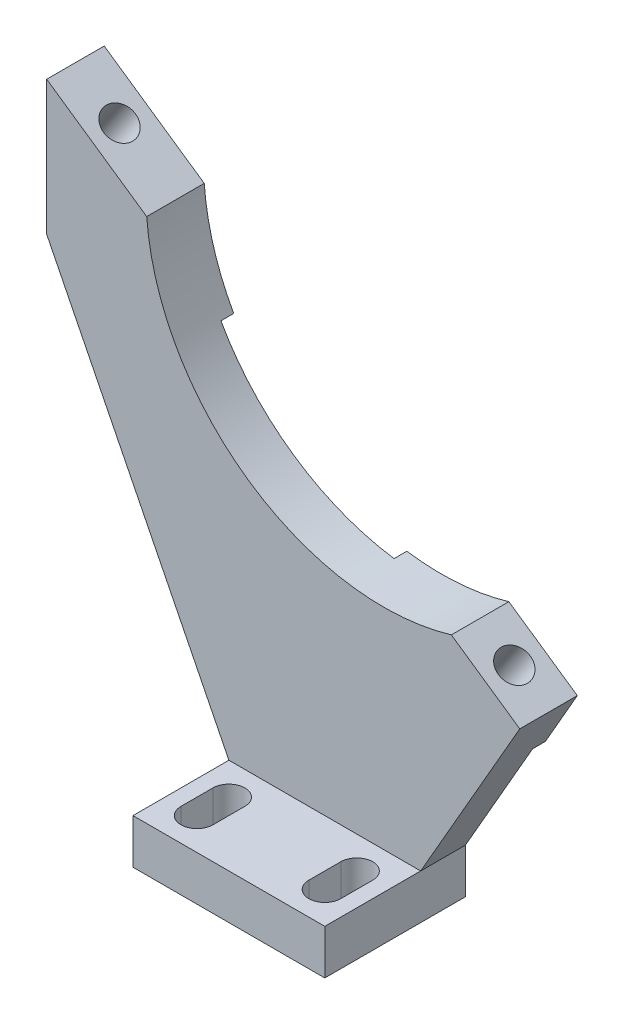
ISO-10303-21;
HEADER;
FILE_DESCRIPTION(('STEP AP214'),'2;1');
FILE_NAME('part.step','',(''),(''),'','','');
FILE_SCHEMA(('AUTOMOTIVE_DESIGN { 1 0 10303 214 1 1 1 1 }'));
ENDSEC;
DATA;
#1=APPLICATION_CONTEXT('core data for automotive mechanical design processes');
#2=APPLICATION_PROTOCOL_DEFINITION('international standard','automotive_design',2000,#1);
#3=PRODUCT_CONTEXT('',#1,'mechanical');
#4=PRODUCT('Part','Part','',(#3));
#5=PRODUCT_RELATED_PRODUCT_CATEGORY('part','',(#4));
#6=PRODUCT_DEFINITION_FORMATION('','',#4);
#7=PRODUCT_DEFINITION_CONTEXT('part definition',#1,'design');
#8=PRODUCT_DEFINITION('design','',#6,#7);
#9=PRODUCT_DEFINITION_SHAPE('','',#8);
#10=(LENGTH_UNIT() NAMED_UNIT(*) SI_UNIT(.MILLI.,.METRE.));
#11=(NAMED_UNIT(*) PLANE_ANGLE_UNIT() SI_UNIT($,.RADIAN.));
#12=(NAMED_UNIT(*) SI_UNIT($,.STERADIAN.) SOLID_ANGLE_UNIT());
#13=UNCERTAINTY_MEASURE_WITH_UNIT(LENGTH_MEASURE(1.E-05),#10,'distance_accuracy_value','');
#14=(GEOMETRIC_REPRESENTATION_CONTEXT(3) GLOBAL_UNCERTAINTY_ASSIGNED_CONTEXT((#13)) GLOBAL_UNIT_ASSIGNED_CONTEXT((#10,
#11,#12)) REPRESENTATION_CONTEXT('',''));
#15=CARTESIAN_POINT('',(0.,0.,0.));
#16=DIRECTION('',(0.,0.,1.));
#17=DIRECTION('',(1.,0.,0.));
#18=AXIS2_PLACEMENT_3D('',#15,#16,#17);
#19=CARTESIAN_POINT('',(0.,7.,-14.5));
#20=DIRECTION('',(0.,0.,-1.));
#21=DIRECTION('',(-1.,0.,0.));
#22=AXIS2_PLACEMENT_3D('',#19,#20,#21);
#23=PLANE('',#22);
#24=DIRECTION('',(0.823392066685729,-0.567472910823948,0.));
#25=VECTOR('',#24,1.);
#26=CARTESIAN_POINT('',(20.0336403358611,29.0684193108572,-14.5));
#27=LINE('',#26,#25);
#28=CARTESIAN_POINT('',(-43.5,72.8551173801669,-14.5));
#29=VERTEX_POINT('',#28);
#30=CARTESIAN_POINT('',(-23.246350455697,58.8965210726067,-14.5));
#31=VERTEX_POINT('',#30);
#32=EDGE_CURVE('E50',#29,#31,#27,.T.);
#33=ORIENTED_EDGE('',*,*,#32,.T.);
#34=CARTESIAN_POINT('',(9.21537222762914,77.016100993809,-14.5));
#35=DIRECTION('',(0.,0.,-1.));
#36=DIRECTION('',(-1.,0.,0.));
#37=AXIS2_PLACEMENT_3D('',#34,#35,#36);
#38=CIRCLE('',#37,37.1763717445639);
#39=CARTESIAN_POINT('',(3.83724463933241,40.230800128735,-14.5));
#40=VERTEX_POINT('',#39);
#41=EDGE_CURVE('E244',#40,#31,#38,.T.);
#42=ORIENTED_EDGE('',*,*,#41,.F.);
#43=DIRECTION('',(0.823392066685729,-0.567472910823948,0.));
#44=VECTOR('',#43,1.);
#45=CARTESIAN_POINT('',(20.0336403358611,29.0684193108572,-14.5));
#46=LINE('',#45,#44);
#47=CARTESIAN_POINT('',(25.5044180150803,25.2980184778818,-14.5));
#48=VERTEX_POINT('',#47);
#49=EDGE_CURVE('E226',#40,#48,#46,.T.);
#50=ORIENTED_EDGE('',*,*,#49,.T.);
#51=DIRECTION('',(-0.497867518553315,-0.867253096834808,0.));
#52=VECTOR('',#51,1.);
#53=CARTESIAN_POINT('',(8.2594789785917,-4.74155274696931,-14.5));
#54=LINE('',#53,#52);
#55=CARTESIAN_POINT('',(15.,7.,-14.5));
#56=VERTEX_POINT('',#55);
#57=EDGE_CURVE('E264',#48,#56,#54,.T.);
#58=ORIENTED_EDGE('',*,*,#57,.T.);
#59=DIRECTION('',(0.,-1.,0.));
#60=VECTOR('',#59,1.);
#61=CARTESIAN_POINT('',(15.,7.,-14.5));
#62=LINE('',#61,#60);
#63=CARTESIAN_POINT('',(15.,0.,-14.5));
#64=VERTEX_POINT('',#63);
#65=EDGE_CURVE('E11',#56,#64,#62,.T.);
#66=ORIENTED_EDGE('',*,*,#65,.T.);
#67=DIRECTION('',(1.,0.,0.));
#68=VECTOR('',#67,1.);
#69=CARTESIAN_POINT('',(0.,0.,-14.5));
#70=LINE('',#69,#68);
#71=CARTESIAN_POINT('',(-15.,0.,-14.5));
#72=VERTEX_POINT('',#71);
#73=EDGE_CURVE('E340',#72,#64,#70,.T.);
#74=ORIENTED_EDGE('',*,*,#73,.F.);
#75=DIRECTION('',(0.,-1.,0.));
#76=VECTOR('',#75,1.);
#77=CARTESIAN_POINT('',(-15.,7.,-14.5));
#78=LINE('',#77,#76);
#79=CARTESIAN_POINT('',(-15.,7.,-14.5));
#80=VERTEX_POINT('',#79);
#81=EDGE_CURVE('E42',#80,#72,#78,.T.);
#82=ORIENTED_EDGE('',*,*,#81,.F.);
#83=DIRECTION('',(-0.447213595499958,0.894427190999916,0.));
#84=VECTOR('',#83,1.);
#85=CARTESIAN_POINT('',(-9.2,-4.6,-14.5));
#86=LINE('',#85,#84);
#87=CARTESIAN_POINT('',(-43.5,64.,-14.5));
#88=VERTEX_POINT('',#87);
#89=EDGE_CURVE('E266',#80,#88,#86,.T.);
#90=ORIENTED_EDGE('',*,*,#89,.T.);
#91=DIRECTION('',(0.,1.,0.));
#92=VECTOR('',#91,1.);
#93=CARTESIAN_POINT('',(-43.5,0.,-14.5));
#94=LINE('',#93,#92);
#95=EDGE_CURVE('E55',#88,#29,#94,.T.);
#96=ORIENTED_EDGE('',*,*,#95,.T.);
#97=EDGE_LOOP('',(#33,#42,#50,#58,#66,#74,#82,#90,#96));
#98=FACE_BOUND('',#97,.T.);
#99=ADVANCED_FACE('F33',(#98),#23,.T.);
#100=CARTESIAN_POINT('',(15.,7.,0.));
#101=DIRECTION('',(1.,0.,0.));
#102=DIRECTION('',(0.,0.,-1.));
#103=AXIS2_PLACEMENT_3D('',#100,#101,#102);
#104=PLANE('',#103);
#105=DIRECTION('',(0.,0.,1.));
#106=VECTOR('',#105,1.);
#107=CARTESIAN_POINT('',(15.,0.,0.));
#108=LINE('',#107,#106);
#109=CARTESIAN_POINT('',(15.,0.,7.5));
#110=VERTEX_POINT('',#109);
#111=EDGE_CURVE('E337',#64,#110,#108,.T.);
#112=ORIENTED_EDGE('',*,*,#111,.F.);
#113=ORIENTED_EDGE('',*,*,#65,.F.);
#114=DIRECTION('',(0.,0.,1.));
#115=VECTOR('',#114,1.);
#116=CARTESIAN_POINT('',(15.,7.,0.));
#117=LINE('',#116,#115);
#118=CARTESIAN_POINT('',(15.,7.,-7.5));
#119=VERTEX_POINT('',#118);
#120=EDGE_CURVE('E304',#56,#119,#117,.T.);
#121=ORIENTED_EDGE('',*,*,#120,.T.);
#122=CARTESIAN_POINT('',(15.,7.,7.5));
#123=VERTEX_POINT('',#122);
#124=EDGE_CURVE('E303',#119,#123,#117,.T.);
#125=ORIENTED_EDGE('',*,*,#124,.T.);
#126=DIRECTION('',(0.,-1.,0.));
#127=VECTOR('',#126,1.);
#128=CARTESIAN_POINT('',(15.,7.,7.5));
#129=LINE('',#128,#127);
#130=EDGE_CURVE('E348',#123,#110,#129,.T.);
#131=ORIENTED_EDGE('',*,*,#130,.T.);
#132=EDGE_LOOP('',(#112,#113,#121,#125,#131));
#133=FACE_BOUND('',#132,.T.);
#134=ADVANCED_FACE('F395',(#133),#104,.T.);
#135=CARTESIAN_POINT('',(-15.,7.,0.));
#136=DIRECTION('',(1.,0.,0.));
#137=DIRECTION('',(0.,0.,-1.));
#138=AXIS2_PLACEMENT_3D('',#135,#136,#137);
#139=PLANE('',#138);
#140=DIRECTION('',(0.,0.,1.));
#141=VECTOR('',#140,1.);
#142=CARTESIAN_POINT('',(-15.,0.,0.));
#143=LINE('',#142,#141);
#144=CARTESIAN_POINT('',(-15.,0.,7.5));
#145=VERTEX_POINT('',#144);
#146=EDGE_CURVE('E343',#72,#145,#143,.T.);
#147=ORIENTED_EDGE('',*,*,#146,.T.);
#148=DIRECTION('',(0.,-1.,0.));
#149=VECTOR('',#148,1.);
#150=CARTESIAN_POINT('',(-15.,7.,7.5));
#151=LINE('',#150,#149);
#152=CARTESIAN_POINT('',(-15.,7.,7.5));
#153=VERTEX_POINT('',#152);
#154=EDGE_CURVE('E350',#153,#145,#151,.T.);
#155=ORIENTED_EDGE('',*,*,#154,.F.);
#156=DIRECTION('',(0.,0.,1.));
#157=VECTOR('',#156,1.);
#158=CARTESIAN_POINT('',(-15.,7.,0.));
#159=LINE('',#158,#157);
#160=CARTESIAN_POINT('',(-15.,7.,-7.5));
#161=VERTEX_POINT('',#160);
#162=EDGE_CURVE('E306',#161,#153,#159,.T.);
#163=ORIENTED_EDGE('',*,*,#162,.F.);
#164=EDGE_CURVE('E307',#80,#161,#159,.T.);
#165=ORIENTED_EDGE('',*,*,#164,.F.);
#166=ORIENTED_EDGE('',*,*,#81,.T.);
#167=EDGE_LOOP('',(#147,#155,#163,#165,#166));
#168=FACE_BOUND('',#167,.T.);
#169=ADVANCED_FACE('F400',(#168),#139,.F.);
#170=CARTESIAN_POINT('',(-10.,7.,2.5));
#171=DIRECTION('',(0.,-1.,0.));
#172=DIRECTION('',(0.,0.,-1.));
#173=AXIS2_PLACEMENT_3D('',#170,#171,#172);
#174=CYLINDRICAL_SURFACE('',#173,2.5);
#175=CARTESIAN_POINT('',(-10.,0.,2.5));
#176=DIRECTION('',(0.,1.,0.));
#177=DIRECTION('',(0.,0.,1.));
#178=AXIS2_PLACEMENT_3D('',#175,#176,#177);
#179=CIRCLE('',#178,2.5);
#180=CARTESIAN_POINT('',(-12.5,0.,2.5));
#181=VERTEX_POINT('',#180);
#182=CARTESIAN_POINT('',(-7.5,0.,2.5));
#183=VERTEX_POINT('',#182);
#184=EDGE_CURVE('E325',#181,#183,#179,.T.);
#185=ORIENTED_EDGE('',*,*,#184,.F.);
#186=DIRECTION('',(0.,-1.,0.));
#187=VECTOR('',#186,1.);
#188=CARTESIAN_POINT('',(-12.5,7.,2.5));
#189=LINE('',#188,#187);
#190=CARTESIAN_POINT('',(-12.5,7.,2.5));
#191=VERTEX_POINT('',#190);
#192=EDGE_CURVE('E351',#191,#181,#189,.T.);
#193=ORIENTED_EDGE('',*,*,#192,.F.);
#194=CARTESIAN_POINT('',(-10.,7.,2.5));
#195=DIRECTION('',(0.,1.,0.));
#196=DIRECTION('',(0.,0.,1.));
#197=AXIS2_PLACEMENT_3D('',#194,#195,#196);
#198=CIRCLE('',#197,2.5);
#199=CARTESIAN_POINT('',(-7.5,7.,2.5));
#200=VERTEX_POINT('',#199);
#201=EDGE_CURVE('E292',#191,#200,#198,.T.);
#202=ORIENTED_EDGE('',*,*,#201,.T.);
#203=DIRECTION('',(0.,-1.,0.));
#204=VECTOR('',#203,1.);
#205=CARTESIAN_POINT('',(-7.5,7.,2.5));
#206=LINE('',#205,#204);
#207=EDGE_CURVE('E355',#200,#183,#206,.T.);
#208=ORIENTED_EDGE('',*,*,#207,.T.);
#209=EDGE_LOOP('',(#185,#193,#202,#208));
#210=FACE_BOUND('',#209,.T.);
#211=ADVANCED_FACE('F413',(#210),#174,.F.);
#212=CARTESIAN_POINT('',(-12.5,7.,0.));
#213=DIRECTION('',(-1.,0.,0.));
#214=DIRECTION('',(0.,0.,1.));
#215=AXIS2_PLACEMENT_3D('',#212,#213,#214);
#216=PLANE('',#215);
#217=DIRECTION('',(0.,0.,-1.));
#218=VECTOR('',#217,1.);
#219=CARTESIAN_POINT('',(-12.5,0.,0.));
#220=LINE('',#219,#218);
#221=CARTESIAN_POINT('',(-12.5,0.,-2.5));
#222=VERTEX_POINT('',#221);
#223=EDGE_CURVE('E328',#181,#222,#220,.T.);
#224=ORIENTED_EDGE('',*,*,#223,.T.);
#225=DIRECTION('',(0.,-1.,0.));
#226=VECTOR('',#225,1.);
#227=CARTESIAN_POINT('',(-12.5,7.,-2.5));
#228=LINE('',#227,#226);
#229=CARTESIAN_POINT('',(-12.5,7.,-2.5));
#230=VERTEX_POINT('',#229);
#231=EDGE_CURVE('E359',#230,#222,#228,.T.);
#232=ORIENTED_EDGE('',*,*,#231,.F.);
#233=DIRECTION('',(0.,0.,-1.));
#234=VECTOR('',#233,1.);
#235=CARTESIAN_POINT('',(-12.5,7.,0.));
#236=LINE('',#235,#234);
#237=EDGE_CURVE('E295',#191,#230,#236,.T.);
#238=ORIENTED_EDGE('',*,*,#237,.F.);
#239=ORIENTED_EDGE('',*,*,#192,.T.);
#240=EDGE_LOOP('',(#224,#232,#238,#239));
#241=FACE_BOUND('',#240,.T.);
#242=ADVANCED_FACE('F409',(#241),#216,.F.);
#243=CARTESIAN_POINT('',(-10.,7.,-2.5));
#244=DIRECTION('',(0.,-1.,0.));
#245=DIRECTION('',(0.,0.,-1.));
#246=AXIS2_PLACEMENT_3D('',#243,#244,#245);
#247=CYLINDRICAL_SURFACE('',#246,2.5);
#248=CARTESIAN_POINT('',(-10.,0.,-2.5));
#249=DIRECTION('',(0.,1.,0.));
#250=DIRECTION('',(0.,0.,1.));
#251=AXIS2_PLACEMENT_3D('',#248,#249,#250);
#252=CIRCLE('',#251,2.5);
#253=CARTESIAN_POINT('',(-7.5,0.,-2.5));
#254=VERTEX_POINT('',#253);
#255=EDGE_CURVE('E331',#254,#222,#252,.T.);
#256=ORIENTED_EDGE('',*,*,#255,.F.);
#257=DIRECTION('',(0.,-1.,0.));
#258=VECTOR('',#257,1.);
#259=CARTESIAN_POINT('',(-7.5,7.,-2.5));
#260=LINE('',#259,#258);
#261=CARTESIAN_POINT('',(-7.5,7.,-2.5));
#262=VERTEX_POINT('',#261);
#263=EDGE_CURVE('E357',#262,#254,#260,.T.);
#264=ORIENTED_EDGE('',*,*,#263,.F.);
#265=CARTESIAN_POINT('',(-10.,7.,-2.5));
#266=DIRECTION('',(0.,1.,0.));
#267=DIRECTION('',(0.,0.,1.));
#268=AXIS2_PLACEMENT_3D('',#265,#266,#267);
#269=CIRCLE('',#268,2.5);
#270=EDGE_CURVE('E297',#262,#230,#269,.T.);
#271=ORIENTED_EDGE('',*,*,#270,.T.);
#272=ORIENTED_EDGE('',*,*,#231,.T.);
#273=EDGE_LOOP('',(#256,#264,#271,#272));
#274=FACE_BOUND('',#273,.T.);
#275=ADVANCED_FACE('F406',(#274),#247,.F.);
#276=CARTESIAN_POINT('',(10.,7.,2.5));
#277=DIRECTION('',(0.,-1.,0.));
#278=DIRECTION('',(0.,0.,-1.));
#279=AXIS2_PLACEMENT_3D('',#276,#277,#278);
#280=CYLINDRICAL_SURFACE('',#279,2.5);
#281=CARTESIAN_POINT('',(10.,0.,2.5));
#282=DIRECTION('',(0.,1.,0.));
#283=DIRECTION('',(0.,0.,1.));
#284=AXIS2_PLACEMENT_3D('',#281,#282,#283);
#285=CIRCLE('',#284,2.5);
#286=CARTESIAN_POINT('',(7.5,0.,2.5));
#287=VERTEX_POINT('',#286);
#288=CARTESIAN_POINT('',(12.5,0.,2.5));
#289=VERTEX_POINT('',#288);
#290=EDGE_CURVE('E271',#287,#289,#285,.T.);
#291=ORIENTED_EDGE('',*,*,#290,.F.);
#292=DIRECTION('',(0.,-1.,0.));
#293=VECTOR('',#292,1.);
#294=CARTESIAN_POINT('',(7.5,7.,2.5));
#295=LINE('',#294,#293);
#296=CARTESIAN_POINT('',(7.5,7.,2.5));
#297=VERTEX_POINT('',#296);
#298=EDGE_CURVE('E37',#297,#287,#295,.T.);
#299=ORIENTED_EDGE('',*,*,#298,.F.);
#300=CARTESIAN_POINT('',(10.,7.,2.5));
#301=DIRECTION('',(0.,1.,0.));
#302=DIRECTION('',(0.,0.,1.));
#303=AXIS2_PLACEMENT_3D('',#300,#301,#302);
#304=CIRCLE('',#303,2.5);
#305=CARTESIAN_POINT('',(12.5,7.,2.5));
#306=VERTEX_POINT('',#305);
#307=EDGE_CURVE('E280',#297,#306,#304,.T.);
#308=ORIENTED_EDGE('',*,*,#307,.T.);
#309=DIRECTION('',(0.,-1.,0.));
#310=VECTOR('',#309,1.);
#311=CARTESIAN_POINT('',(12.5,7.,2.5));
#312=LINE('',#311,#310);
#313=EDGE_CURVE('E313',#306,#289,#312,.T.);
#314=ORIENTED_EDGE('',*,*,#313,.T.);
#315=EDGE_LOOP('',(#291,#299,#308,#314));
#316=FACE_BOUND('',#315,.T.);
#317=ADVANCED_FACE('F35',(#316),#280,.F.);
#318=CARTESIAN_POINT('',(7.5,7.,0.));
#319=DIRECTION('',(-1.,0.,0.));
#320=DIRECTION('',(0.,0.,1.));
#321=AXIS2_PLACEMENT_3D('',#318,#319,#320);
#322=PLANE('',#321);
#323=DIRECTION('',(0.,0.,-1.));
#324=VECTOR('',#323,1.);
#325=CARTESIAN_POINT('',(7.5,0.,0.));
#326=LINE('',#325,#324);
#327=CARTESIAN_POINT('',(7.5,0.,-2.5));
#328=VERTEX_POINT('',#327);
#329=EDGE_CURVE('E316',#287,#328,#326,.T.);
#330=ORIENTED_EDGE('',*,*,#329,.T.);
#331=DIRECTION('',(0.,-1.,0.));
#332=VECTOR('',#331,1.);
#333=CARTESIAN_POINT('',(7.5,7.,-2.5));
#334=LINE('',#333,#332);
#335=CARTESIAN_POINT('',(7.5,7.,-2.5));
#336=VERTEX_POINT('',#335);
#337=EDGE_CURVE('E364',#336,#328,#334,.T.);
#338=ORIENTED_EDGE('',*,*,#337,.F.);
#339=DIRECTION('',(0.,0.,-1.));
#340=VECTOR('',#339,1.);
#341=CARTESIAN_POINT('',(7.5,7.,0.));
#342=LINE('',#341,#340);
#343=EDGE_CURVE('E283',#297,#336,#342,.T.);
#344=ORIENTED_EDGE('',*,*,#343,.F.);
#345=ORIENTED_EDGE('',*,*,#298,.T.);
#346=EDGE_LOOP('',(#330,#338,#344,#345));
#347=FACE_BOUND('',#346,.T.);
#348=ADVANCED_FACE('F371',(#347),#322,.F.);
#349=CARTESIAN_POINT('',(10.,7.,-2.5));
#350=DIRECTION('',(0.,-1.,0.));
#351=DIRECTION('',(0.,0.,-1.));
#352=AXIS2_PLACEMENT_3D('',#349,#350,#351);
#353=CYLINDRICAL_SURFACE('',#352,2.5);
#354=CARTESIAN_POINT('',(10.,0.,-2.5));
#355=DIRECTION('',(0.,1.,0.));
#356=DIRECTION('',(0.,0.,1.));
#357=AXIS2_PLACEMENT_3D('',#354,#355,#356);
#358=CIRCLE('',#357,2.5);
#359=CARTESIAN_POINT('',(12.5,0.,-2.5));
#360=VERTEX_POINT('',#359);
#361=EDGE_CURVE('E319',#360,#328,#358,.T.);
#362=ORIENTED_EDGE('',*,*,#361,.F.);
#363=DIRECTION('',(0.,-1.,0.));
#364=VECTOR('',#363,1.);
#365=CARTESIAN_POINT('',(12.5,7.,-2.5));
#366=LINE('',#365,#364);
#367=CARTESIAN_POINT('',(12.5,7.,-2.5));
#368=VERTEX_POINT('',#367);
#369=EDGE_CURVE('E363',#368,#360,#366,.T.);
#370=ORIENTED_EDGE('',*,*,#369,.F.);
#371=CARTESIAN_POINT('',(10.,7.,-2.5));
#372=DIRECTION('',(0.,1.,0.));
#373=DIRECTION('',(0.,0.,1.));
#374=AXIS2_PLACEMENT_3D('',#371,#372,#373);
#375=CIRCLE('',#374,2.5);
#376=EDGE_CURVE('E286',#368,#336,#375,.T.);
#377=ORIENTED_EDGE('',*,*,#376,.T.);
#378=ORIENTED_EDGE('',*,*,#337,.T.);
#379=EDGE_LOOP('',(#362,#370,#377,#378));
#380=FACE_BOUND('',#379,.T.);
#381=ADVANCED_FACE('F383',(#380),#353,.F.);
#382=CARTESIAN_POINT('',(-7.5,7.,0.));
#383=DIRECTION('',(-1.,0.,0.));
#384=DIRECTION('',(0.,0.,1.));
#385=AXIS2_PLACEMENT_3D('',#382,#383,#384);
#386=PLANE('',#385);
#387=DIRECTION('',(0.,0.,-1.));
#388=VECTOR('',#387,1.);
#389=CARTESIAN_POINT('',(-7.5,0.,0.));
#390=LINE('',#389,#388);
#391=EDGE_CURVE('E334',#183,#254,#390,.T.);
#392=ORIENTED_EDGE('',*,*,#391,.F.);
#393=ORIENTED_EDGE('',*,*,#207,.F.);
#394=DIRECTION('',(0.,0.,-1.));
#395=VECTOR('',#394,1.);
#396=CARTESIAN_POINT('',(-7.5,7.,0.));
#397=LINE('',#396,#395);
#398=EDGE_CURVE('E300',#200,#262,#397,.T.);
#399=ORIENTED_EDGE('',*,*,#398,.T.);
#400=ORIENTED_EDGE('',*,*,#263,.T.);
#401=EDGE_LOOP('',(#392,#393,#399,#400));
#402=FACE_BOUND('',#401,.T.);
#403=ADVANCED_FACE('F385',(#402),#386,.T.);
#404=CARTESIAN_POINT('',(12.5,7.,0.));
#405=DIRECTION('',(-1.,0.,0.));
#406=DIRECTION('',(0.,0.,1.));
#407=AXIS2_PLACEMENT_3D('',#404,#405,#406);
#408=PLANE('',#407);
#409=DIRECTION('',(0.,0.,-1.));
#410=VECTOR('',#409,1.);
#411=CARTESIAN_POINT('',(12.5,0.,0.));
#412=LINE('',#411,#410);
#413=EDGE_CURVE('E322',#289,#360,#412,.T.);
#414=ORIENTED_EDGE('',*,*,#413,.F.);
#415=ORIENTED_EDGE('',*,*,#313,.F.);
#416=DIRECTION('',(0.,0.,-1.));
#417=VECTOR('',#416,1.);
#418=CARTESIAN_POINT('',(12.5,7.,0.));
#419=LINE('',#418,#417);
#420=EDGE_CURVE('E289',#306,#368,#419,.T.);
#421=ORIENTED_EDGE('',*,*,#420,.T.);
#422=ORIENTED_EDGE('',*,*,#369,.T.);
#423=EDGE_LOOP('',(#414,#415,#421,#422));
#424=FACE_BOUND('',#423,.T.);
#425=ADVANCED_FACE('F381',(#424),#408,.T.);
#426=CARTESIAN_POINT('',(0.,7.,7.5));
#427=DIRECTION('',(0.,0.,-1.));
#428=DIRECTION('',(-1.,0.,0.));
#429=AXIS2_PLACEMENT_3D('',#426,#427,#428);
#430=PLANE('',#429);
#431=DIRECTION('',(1.,0.,0.));
#432=VECTOR('',#431,1.);
#433=CARTESIAN_POINT('',(0.,0.,7.5));
#434=LINE('',#433,#432);
#435=EDGE_CURVE('E284',#145,#110,#434,.T.);
#436=ORIENTED_EDGE('',*,*,#435,.T.);
#437=ORIENTED_EDGE('',*,*,#130,.F.);
#438=DIRECTION('',(1.,0.,0.));
#439=VECTOR('',#438,1.);
#440=CARTESIAN_POINT('',(0.,7.,7.5));
#441=LINE('',#440,#439);
#442=EDGE_CURVE('E310',#153,#123,#441,.T.);
#443=ORIENTED_EDGE('',*,*,#442,.F.);
#444=ORIENTED_EDGE('',*,*,#154,.T.);
#445=EDGE_LOOP('',(#436,#437,#443,#444));
#446=FACE_BOUND('',#445,.T.);
#447=ADVANCED_FACE('F418',(#446),#430,.F.);
#448=CARTESIAN_POINT('',(0.,7.,0.));
#449=DIRECTION('',(0.,1.,0.));
#450=DIRECTION('',(0.,0.,1.));
#451=AXIS2_PLACEMENT_3D('',#448,#449,#450);
#452=PLANE('',#451);
#453=DIRECTION('',(1.,0.,0.));
#454=VECTOR('',#453,1.);
#455=CARTESIAN_POINT('',(0.,7.,-7.5));
#456=LINE('',#455,#454);
#457=EDGE_CURVE('E254',#161,#119,#456,.T.);
#458=ORIENTED_EDGE('',*,*,#457,.F.);
#459=ORIENTED_EDGE('',*,*,#162,.T.);
#460=ORIENTED_EDGE('',*,*,#442,.T.);
#461=ORIENTED_EDGE('',*,*,#124,.F.);
#462=EDGE_LOOP('',(#458,#459,#460,#461));
#463=FACE_BOUND('',#462,.T.);
#464=ORIENTED_EDGE('',*,*,#307,.F.);
#465=ORIENTED_EDGE('',*,*,#343,.T.);
#466=ORIENTED_EDGE('',*,*,#376,.F.);
#467=ORIENTED_EDGE('',*,*,#420,.F.);
#468=EDGE_LOOP('',(#464,#465,#466,#467));
#469=FACE_BOUND('',#468,.T.);
#470=ORIENTED_EDGE('',*,*,#201,.F.);
#471=ORIENTED_EDGE('',*,*,#237,.T.);
#472=ORIENTED_EDGE('',*,*,#270,.F.);
#473=ORIENTED_EDGE('',*,*,#398,.F.);
#474=EDGE_LOOP('',(#470,#471,#472,#473));
#475=FACE_BOUND('',#474,.T.);
#476=ADVANCED_FACE('F422',(#463,#469,#475),#452,.T.);
#477=CARTESIAN_POINT('',(0.,0.,0.));
#478=DIRECTION('',(0.,1.,0.));
#479=DIRECTION('',(0.,0.,1.));
#480=AXIS2_PLACEMENT_3D('',#477,#478,#479);
#481=PLANE('',#480);
#482=ORIENTED_EDGE('',*,*,#290,.T.);
#483=ORIENTED_EDGE('',*,*,#413,.T.);
#484=ORIENTED_EDGE('',*,*,#361,.T.);
#485=ORIENTED_EDGE('',*,*,#329,.F.);
#486=EDGE_LOOP('',(#482,#483,#484,#485));
#487=FACE_BOUND('',#486,.T.);
#488=ORIENTED_EDGE('',*,*,#184,.T.);
#489=ORIENTED_EDGE('',*,*,#391,.T.);
#490=ORIENTED_EDGE('',*,*,#255,.T.);
#491=ORIENTED_EDGE('',*,*,#223,.F.);
#492=EDGE_LOOP('',(#488,#489,#490,#491));
#493=FACE_BOUND('',#492,.T.);
#494=ORIENTED_EDGE('',*,*,#111,.T.);
#495=ORIENTED_EDGE('',*,*,#435,.F.);
#496=ORIENTED_EDGE('',*,*,#146,.F.);
#497=ORIENTED_EDGE('',*,*,#73,.T.);
#498=EDGE_LOOP('',(#494,#495,#496,#497));
#499=FACE_BOUND('',#498,.T.);
#500=ADVANCED_FACE('F376',(#487,#493,#499),#481,.F.);
#501=CARTESIAN_POINT('',(9.21537222762914,77.016100993809,-7.5));
#502=DIRECTION('',(0.,0.,-1.));
#503=DIRECTION('',(-1.,0.,0.));
#504=AXIS2_PLACEMENT_3D('',#501,#502,#503);
#505=CYLINDRICAL_SURFACE('',#504,37.1763717445639);
#506=DIRECTION('',(0.,0.,-1.));
#507=VECTOR('',#506,1.);
#508=CARTESIAN_POINT('',(19.7959031330855,41.3771478407113,-7.5));
#509=LINE('',#508,#507);
#510=CARTESIAN_POINT('',(19.7959031330855,41.3771478407113,-7.5));
#511=VERTEX_POINT('',#510);
#512=CARTESIAN_POINT('',(19.7959031330855,41.3771478407113,-16.5));
#513=VERTEX_POINT('',#512);
#514=EDGE_CURVE('E278',#511,#513,#509,.T.);
#515=ORIENTED_EDGE('',*,*,#514,.T.);
#516=CARTESIAN_POINT('',(9.21537222762914,77.016100993809,-16.5));
#517=DIRECTION('',(0.,0.,-1.));
#518=DIRECTION('',(-1.,0.,0.));
#519=AXIS2_PLACEMENT_3D('',#516,#517,#518);
#520=CIRCLE('',#519,37.1763717445639);
#521=CARTESIAN_POINT('',(3.83724463933241,40.230800128735,-16.5));
#522=VERTEX_POINT('',#521);
#523=EDGE_CURVE('E230',#522,#513,#520,.F.);
#524=ORIENTED_EDGE('',*,*,#523,.F.);
#525=DIRECTION('',(0.,0.,1.));
#526=VECTOR('',#525,1.);
#527=CARTESIAN_POINT('',(3.83724463933241,40.230800128735,-16.5));
#528=LINE('',#527,#526);
#529=EDGE_CURVE('E242',#522,#40,#528,.T.);
#530=ORIENTED_EDGE('',*,*,#529,.T.);
#531=ORIENTED_EDGE('',*,*,#41,.T.);
#532=DIRECTION('',(0.,0.,1.));
#533=VECTOR('',#532,1.);
#534=CARTESIAN_POINT('',(-23.246350455697,58.8965210726067,-16.5));
#535=LINE('',#534,#533);
#536=CARTESIAN_POINT('',(-23.246350455697,58.8965210726067,-16.5));
#537=VERTEX_POINT('',#536);
#538=EDGE_CURVE('E220',#537,#31,#535,.T.);
#539=ORIENTED_EDGE('',*,*,#538,.F.);
#540=CARTESIAN_POINT('',(9.21537222762914,77.016100993809,-16.5));
#541=DIRECTION('',(0.,0.,-1.));
#542=DIRECTION('',(-1.,0.,0.));
#543=AXIS2_PLACEMENT_3D('',#540,#541,#542);
#544=CIRCLE('',#543,37.1763717445639);
#545=CARTESIAN_POINT('',(-27.8555507329711,74.218014694345,-16.5));
#546=VERTEX_POINT('',#545);
#547=EDGE_CURVE('E218',#546,#537,#544,.F.);
#548=ORIENTED_EDGE('',*,*,#547,.F.);
#549=DIRECTION('',(0.,0.,-1.));
#550=VECTOR('',#549,1.);
#551=CARTESIAN_POINT('',(-27.8555507329712,74.218014694345,-7.5));
#552=LINE('',#551,#550);
#553=CARTESIAN_POINT('',(-27.8555507329712,74.218014694345,-7.5));
#554=VERTEX_POINT('',#553);
#555=EDGE_CURVE('E269',#554,#546,#552,.T.);
#556=ORIENTED_EDGE('',*,*,#555,.F.);
#557=CARTESIAN_POINT('',(9.21537222762914,77.016100993809,-7.5));
#558=DIRECTION('',(0.,0.,-1.));
#559=DIRECTION('',(-1.,0.,0.));
#560=AXIS2_PLACEMENT_3D('',#557,#558,#559);
#561=CIRCLE('',#560,37.1763717445639);
#562=EDGE_CURVE('E245',#511,#554,#561,.T.);
#563=ORIENTED_EDGE('',*,*,#562,.F.);
#564=EDGE_LOOP('',(#515,#524,#530,#531,#539,#548,#556,#563));
#565=FACE_BOUND('',#564,.T.);
#566=ADVANCED_FACE('F431',(#565),#505,.F.);
#567=CARTESIAN_POINT('',(25.7083694441005,37.3023399777145,-7.5));
#568=DIRECTION('',(0.567472910823948,0.823392066685729,0.));
#569=DIRECTION('',(-0.823392066685729,0.567472910823948,0.));
#570=AXIS2_PLACEMENT_3D('',#567,#568,#569);
#571=PLANE('',#570);
#572=CARTESIAN_POINT('',(-36.6064534348869,80.2490422321518,-12.));
#573=DIRECTION('',(0.567472910823948,0.823392066685729,0.));
#574=DIRECTION('',(-0.823392066685729,0.567472910823948,0.));
#575=AXIS2_PLACEMENT_3D('',#572,#573,#574);
#576=CIRCLE('',#575,2.5);
#577=CARTESIAN_POINT('',(-38.6649336016012,81.6677245092117,-12.));
#578=VERTEX_POINT('',#577);
#579=EDGE_CURVE('E199',#578,#578,#576,.T.);
#580=ORIENTED_EDGE('',*,*,#579,.F.);
#581=EDGE_LOOP('',(#580));
#582=FACE_BOUND('',#581,.T.);
#583=ORIENTED_EDGE('',*,*,#555,.T.);
#584=DIRECTION('',(0.823392066685729,-0.567472910823948,0.));
#585=VECTOR('',#584,1.);
#586=CARTESIAN_POINT('',(25.7083694441005,37.3023399777145,-16.5));
#587=LINE('',#586,#585);
#588=CARTESIAN_POINT('',(-43.5,85.,-16.5));
#589=VERTEX_POINT('',#588);
#590=EDGE_CURVE('E215',#589,#546,#587,.T.);
#591=ORIENTED_EDGE('',*,*,#590,.F.);
#592=DIRECTION('',(0.,0.,-1.));
#593=VECTOR('',#592,1.);
#594=CARTESIAN_POINT('',(-43.5,85.,-7.5));
#595=LINE('',#594,#593);
#596=CARTESIAN_POINT('',(-43.5,85.,-7.5));
#597=VERTEX_POINT('',#596);
#598=EDGE_CURVE('E272',#597,#589,#595,.T.);
#599=ORIENTED_EDGE('',*,*,#598,.F.);
#600=DIRECTION('',(0.823392066685729,-0.567472910823948,0.));
#601=VECTOR('',#600,1.);
#602=CARTESIAN_POINT('',(25.7083694441005,37.3023399777145,-7.5));
#603=LINE('',#602,#601);
#604=EDGE_CURVE('E251',#597,#554,#603,.T.);
#605=ORIENTED_EDGE('',*,*,#604,.T.);
#606=EDGE_LOOP('',(#583,#591,#599,#605));
#607=FACE_BOUND('',#606,.T.);
#608=ADVANCED_FACE('F435',(#582,#607),#571,.T.);
#609=CARTESIAN_POINT('',(-43.5,0.,-7.5));
#610=DIRECTION('',(-1.,0.,0.));
#611=DIRECTION('',(0.,-1.,0.));
#612=AXIS2_PLACEMENT_3D('',#609,#610,#611);
#613=PLANE('',#612);
#614=ORIENTED_EDGE('',*,*,#95,.F.);
#615=DIRECTION('',(0.,0.,-1.));
#616=VECTOR('',#615,1.);
#617=CARTESIAN_POINT('',(-43.5,64.,-7.5));
#618=LINE('',#617,#616);
#619=CARTESIAN_POINT('',(-43.5,64.,-7.5));
#620=VERTEX_POINT('',#619);
#621=EDGE_CURVE('E274',#620,#88,#618,.T.);
#622=ORIENTED_EDGE('',*,*,#621,.F.);
#623=DIRECTION('',(0.,1.,0.));
#624=VECTOR('',#623,1.);
#625=CARTESIAN_POINT('',(-43.5,0.,-7.5));
#626=LINE('',#625,#624);
#627=EDGE_CURVE('E260',#620,#597,#626,.T.);
#628=ORIENTED_EDGE('',*,*,#627,.T.);
#629=ORIENTED_EDGE('',*,*,#598,.T.);
#630=DIRECTION('',(0.,1.,0.));
#631=VECTOR('',#630,1.);
#632=CARTESIAN_POINT('',(-43.5,0.,-16.5));
#633=LINE('',#632,#631);
#634=CARTESIAN_POINT('',(-43.5,72.8551173801669,-16.5));
#635=VERTEX_POINT('',#634);
#636=EDGE_CURVE('E212',#635,#589,#633,.T.);
#637=ORIENTED_EDGE('',*,*,#636,.F.);
#638=DIRECTION('',(0.,0.,1.));
#639=VECTOR('',#638,1.);
#640=CARTESIAN_POINT('',(-43.5,72.8551173801669,-16.5));
#641=LINE('',#640,#639);
#642=EDGE_CURVE('E224',#635,#29,#641,.T.);
#643=ORIENTED_EDGE('',*,*,#642,.T.);
#644=EDGE_LOOP('',(#614,#622,#628,#629,#637,#643));
#645=FACE_BOUND('',#644,.T.);
#646=ADVANCED_FACE('F445',(#645),#613,.T.);
#647=CARTESIAN_POINT('',(-9.2,-4.6,-7.5));
#648=DIRECTION('',(-0.894427190999916,-0.447213595499958,0.));
#649=DIRECTION('',(0.447213595499958,-0.894427190999916,0.));
#650=AXIS2_PLACEMENT_3D('',#647,#648,#649);
#651=PLANE('',#650);
#652=ORIENTED_EDGE('',*,*,#89,.F.);
#653=ORIENTED_EDGE('',*,*,#164,.T.);
#654=DIRECTION('',(-0.447213595499958,0.894427190999916,0.));
#655=VECTOR('',#654,1.);
#656=CARTESIAN_POINT('',(-9.2,-4.6,-7.5));
#657=LINE('',#656,#655);
#658=EDGE_CURVE('E257',#161,#620,#657,.T.);
#659=ORIENTED_EDGE('',*,*,#658,.T.);
#660=ORIENTED_EDGE('',*,*,#621,.T.);
#661=EDGE_LOOP('',(#652,#653,#659,#660));
#662=FACE_BOUND('',#661,.T.);
#663=ADVANCED_FACE('F441',(#662),#651,.T.);
#664=CARTESIAN_POINT('',(8.2594789785917,-4.74155274696931,-7.5));
#665=DIRECTION('',(0.867253096834808,-0.497867518553316,0.));
#666=DIRECTION('',(0.497867518553316,0.867253096834808,0.));
#667=AXIS2_PLACEMENT_3D('',#664,#665,#666);
#668=PLANE('',#667);
#669=ORIENTED_EDGE('',*,*,#57,.F.);
#670=DIRECTION('',(0.,0.,1.));
#671=VECTOR('',#670,1.);
#672=CARTESIAN_POINT('',(25.5044180150803,25.2980184778818,-16.5));
#673=LINE('',#672,#671);
#674=CARTESIAN_POINT('',(25.5044180150803,25.2980184778818,-16.5));
#675=VERTEX_POINT('',#674);
#676=EDGE_CURVE('E238',#675,#48,#673,.T.);
#677=ORIENTED_EDGE('',*,*,#676,.F.);
#678=DIRECTION('',(-0.497867518553315,-0.867253096834808,0.));
#679=VECTOR('',#678,1.);
#680=CARTESIAN_POINT('',(8.2594789785917,-4.74155274696931,-16.5));
#681=LINE('',#680,#679);
#682=CARTESIAN_POINT('',(30.5,34.,-16.5));
#683=VERTEX_POINT('',#682);
#684=EDGE_CURVE('E236',#683,#675,#681,.T.);
#685=ORIENTED_EDGE('',*,*,#684,.F.);
#686=DIRECTION('',(0.,0.,-1.));
#687=VECTOR('',#686,1.);
#688=CARTESIAN_POINT('',(30.5,34.,-7.5));
#689=LINE('',#688,#687);
#690=CARTESIAN_POINT('',(30.5,34.,-7.5));
#691=VERTEX_POINT('',#690);
#692=EDGE_CURVE('E276',#691,#683,#689,.T.);
#693=ORIENTED_EDGE('',*,*,#692,.F.);
#694=DIRECTION('',(-0.497867518553315,-0.867253096834808,0.));
#695=VECTOR('',#694,1.);
#696=CARTESIAN_POINT('',(8.2594789785917,-4.74155274696931,-7.5));
#697=LINE('',#696,#695);
#698=EDGE_CURVE('E250',#691,#119,#697,.T.);
#699=ORIENTED_EDGE('',*,*,#698,.T.);
#700=ORIENTED_EDGE('',*,*,#120,.F.);
#701=EDGE_LOOP('',(#669,#677,#685,#693,#699,#700));
#702=FACE_BOUND('',#701,.T.);
#703=ADVANCED_FACE('F437',(#702),#668,.T.);
#704=CARTESIAN_POINT('',(25.1479515665428,37.6885739203557,-12.));
#705=DIRECTION('',(0.567472910823948,0.823392066685729,0.));
#706=DIRECTION('',(-0.823392066685729,0.567472910823948,0.));
#707=AXIS2_PLACEMENT_3D('',#704,#705,#706);
#708=CIRCLE('',#707,2.5);
#709=CARTESIAN_POINT('',(23.0894713998285,39.1072561974155,-12.));
#710=VERTEX_POINT('',#709);
#711=EDGE_CURVE('E198',#710,#710,#708,.T.);
#712=ORIENTED_EDGE('',*,*,#711,.F.);
#713=EDGE_LOOP('',(#712));
#714=FACE_BOUND('',#713,.T.);
#715=ORIENTED_EDGE('',*,*,#692,.T.);
#716=DIRECTION('',(0.823392066685729,-0.567472910823948,0.));
#717=VECTOR('',#716,1.);
#718=CARTESIAN_POINT('',(25.7083694441005,37.3023399777145,-16.5));
#719=LINE('',#718,#717);
#720=EDGE_CURVE('E233',#513,#683,#719,.T.);
#721=ORIENTED_EDGE('',*,*,#720,.F.);
#722=ORIENTED_EDGE('',*,*,#514,.F.);
#723=EDGE_CURVE('E247',#511,#691,#603,.T.);
#724=ORIENTED_EDGE('',*,*,#723,.T.);
#725=EDGE_LOOP('',(#715,#721,#722,#724));
#726=FACE_BOUND('',#725,.T.);
#727=ADVANCED_FACE('F440',(#714,#726),#571,.T.);
#728=CARTESIAN_POINT('',(0.,0.,-7.5));
#729=DIRECTION('',(0.,0.,-1.));
#730=DIRECTION('',(-1.,0.,0.));
#731=AXIS2_PLACEMENT_3D('',#728,#729,#730);
#732=PLANE('',#731);
#733=ORIENTED_EDGE('',*,*,#562,.T.);
#734=ORIENTED_EDGE('',*,*,#604,.F.);
#735=ORIENTED_EDGE('',*,*,#627,.F.);
#736=ORIENTED_EDGE('',*,*,#658,.F.);
#737=ORIENTED_EDGE('',*,*,#457,.T.);
#738=ORIENTED_EDGE('',*,*,#698,.F.);
#739=ORIENTED_EDGE('',*,*,#723,.F.);
#740=EDGE_LOOP('',(#733,#734,#735,#736,#737,#738,#739));
#741=FACE_BOUND('',#740,.T.);
#742=ADVANCED_FACE('F453',(#741),#732,.F.);
#743=CARTESIAN_POINT('',(20.0336403358611,29.0684193108572,-16.5));
#744=DIRECTION('',(-0.567472910823948,-0.823392066685729,0.));
#745=DIRECTION('',(0.823392066685729,-0.567472910823948,0.));
#746=AXIS2_PLACEMENT_3D('',#743,#744,#745);
#747=PLANE('',#746);
#748=ORIENTED_EDGE('',*,*,#49,.F.);
#749=ORIENTED_EDGE('',*,*,#529,.F.);
#750=DIRECTION('',(0.823392066685729,-0.567472910823948,0.));
#751=VECTOR('',#750,1.);
#752=CARTESIAN_POINT('',(20.0336403358611,29.0684193108572,-16.5));
#753=LINE('',#752,#751);
#754=EDGE_CURVE('E227',#522,#675,#753,.T.);
#755=ORIENTED_EDGE('',*,*,#754,.T.);
#756=ORIENTED_EDGE('',*,*,#676,.T.);
#757=EDGE_LOOP('',(#748,#749,#755,#756));
#758=FACE_BOUND('',#757,.T.);
#759=ADVANCED_FACE('F456',(#758),#747,.T.);
#760=CARTESIAN_POINT('',(0.,0.,-16.5));
#761=DIRECTION('',(0.,0.,-1.));
#762=DIRECTION('',(-1.,0.,0.));
#763=AXIS2_PLACEMENT_3D('',#760,#761,#762);
#764=PLANE('',#763);
#765=ORIENTED_EDGE('',*,*,#754,.F.);
#766=ORIENTED_EDGE('',*,*,#523,.T.);
#767=ORIENTED_EDGE('',*,*,#720,.T.);
#768=ORIENTED_EDGE('',*,*,#684,.T.);
#769=EDGE_LOOP('',(#765,#766,#767,#768));
#770=FACE_BOUND('',#769,.T.);
#771=ADVANCED_FACE('F460',(#770),#764,.T.);
#772=CARTESIAN_POINT('',(20.0336403358611,29.0684193108572,-16.5));
#773=DIRECTION('',(-0.567472910823948,-0.823392066685729,0.));
#774=DIRECTION('',(0.823392066685729,-0.567472910823948,0.));
#775=AXIS2_PLACEMENT_3D('',#772,#773,#774);
#776=PLANE('',#775);
#777=ORIENTED_EDGE('',*,*,#32,.F.);
#778=ORIENTED_EDGE('',*,*,#642,.F.);
#779=DIRECTION('',(0.823392066685729,-0.567472910823948,0.));
#780=VECTOR('',#779,1.);
#781=CARTESIAN_POINT('',(20.0336403358611,29.0684193108572,-16.5));
#782=LINE('',#781,#780);
#783=EDGE_CURVE('E209',#635,#537,#782,.T.);
#784=ORIENTED_EDGE('',*,*,#783,.T.);
#785=ORIENTED_EDGE('',*,*,#538,.T.);
#786=EDGE_LOOP('',(#777,#778,#784,#785));
#787=FACE_BOUND('',#786,.T.);
#788=ADVANCED_FACE('F464',(#787),#776,.T.);
#789=CARTESIAN_POINT('',(0.,0.,-16.5));
#790=DIRECTION('',(0.,0.,-1.));
#791=DIRECTION('',(-1.,0.,0.));
#792=AXIS2_PLACEMENT_3D('',#789,#790,#791);
#793=PLANE('',#792);
#794=ORIENTED_EDGE('',*,*,#783,.F.);
#795=ORIENTED_EDGE('',*,*,#636,.T.);
#796=ORIENTED_EDGE('',*,*,#590,.T.);
#797=ORIENTED_EDGE('',*,*,#547,.T.);
#798=EDGE_LOOP('',(#794,#795,#796,#797));
#799=FACE_BOUND('',#798,.T.);
#800=ADVANCED_FACE('F468',(#799),#793,.T.);
#801=CARTESIAN_POINT('',(20.6081682799512,31.1014373868698,-12.));
#802=DIRECTION('',(0.567472910823948,0.823392066685729,0.));
#803=DIRECTION('',(-0.823392066685729,0.567472910823948,0.));
#804=AXIS2_PLACEMENT_3D('',#801,#802,#803);
#805=CONICAL_SURFACE('',#804,2.5,1.02974425867665);
#806=CARTESIAN_POINT('',(19.7557379687536,29.8645777196419,-12.));
#807=VERTEX_POINT('',#806);
#808=VERTEX_LOOP('',#807);
#809=FACE_BOUND('',#808,.T.);
#810=CARTESIAN_POINT('',(20.6081682799512,31.1014373868698,-12.));
#811=DIRECTION('',(0.567472910823948,0.823392066685729,0.));
#812=DIRECTION('',(-0.823392066685729,0.567472910823948,0.));
#813=AXIS2_PLACEMENT_3D('',#810,#811,#812);
#814=CIRCLE('',#813,2.5);
#815=CARTESIAN_POINT('',(18.5496881132369,32.5201196639297,-12.));
#816=VERTEX_POINT('',#815);
#817=EDGE_CURVE('E202',#816,#816,#814,.T.);
#818=ORIENTED_EDGE('',*,*,#817,.T.);
#819=EDGE_LOOP('',(#818));
#820=FACE_BOUND('',#819,.T.);
#821=ADVANCED_FACE('F472',(#809,#820),#805,.F.);
#822=CARTESIAN_POINT('',(25.1479515665428,37.6885739203557,-12.));
#823=DIRECTION('',(0.567472910823948,0.823392066685729,0.));
#824=DIRECTION('',(-0.823392066685729,0.567472910823948,0.));
#825=AXIS2_PLACEMENT_3D('',#822,#823,#824);
#826=CYLINDRICAL_SURFACE('',#825,2.5);
#827=ORIENTED_EDGE('',*,*,#817,.F.);
#828=EDGE_LOOP('',(#827));
#829=FACE_BOUND('',#828,.T.);
#830=ORIENTED_EDGE('',*,*,#711,.T.);
#831=EDGE_LOOP('',(#830));
#832=FACE_BOUND('',#831,.T.);
#833=ADVANCED_FACE('F192',(#829,#832),#826,.F.);
#834=CARTESIAN_POINT('',(-41.1462367214785,73.661905698666,-12.));
#835=DIRECTION('',(0.567472910823948,0.823392066685729,0.));
#836=DIRECTION('',(-0.823392066685729,0.567472910823948,0.));
#837=AXIS2_PLACEMENT_3D('',#834,#835,#836);
#838=CONICAL_SURFACE('',#837,2.5,1.02974425867666);
#839=CARTESIAN_POINT('',(-41.9986670326761,72.4250460314381,-12.));
#840=VERTEX_POINT('',#839);
#841=VERTEX_LOOP('',#840);
#842=FACE_BOUND('',#841,.T.);
#843=CARTESIAN_POINT('',(-41.1462367214785,73.661905698666,-12.));
#844=DIRECTION('',(0.567472910823948,0.823392066685729,0.));
#845=DIRECTION('',(-0.823392066685729,0.567472910823948,0.));
#846=AXIS2_PLACEMENT_3D('',#843,#844,#845);
#847=CIRCLE('',#846,2.5);
#848=CARTESIAN_POINT('',(-43.2047168881928,75.0805879757258,-12.));
#849=VERTEX_POINT('',#848);
#850=EDGE_CURVE('E196',#849,#849,#847,.T.);
#851=ORIENTED_EDGE('',*,*,#850,.T.);
#852=EDGE_LOOP('',(#851));
#853=FACE_BOUND('',#852,.T.);
#854=ADVANCED_FACE('F188',(#842,#853),#838,.F.);
#855=CARTESIAN_POINT('',(-36.6064534348869,80.2490422321518,-12.));
#856=DIRECTION('',(0.567472910823948,0.823392066685729,0.));
#857=DIRECTION('',(-0.823392066685729,0.567472910823948,0.));
#858=AXIS2_PLACEMENT_3D('',#855,#856,#857);
#859=CYLINDRICAL_SURFACE('',#858,2.5);
#860=ORIENTED_EDGE('',*,*,#850,.F.);
#861=EDGE_LOOP('',(#860));
#862=FACE_BOUND('',#861,.T.);
#863=ORIENTED_EDGE('',*,*,#579,.T.);
#864=EDGE_LOOP('',(#863));
#865=FACE_BOUND('',#864,.T.);
#866=ADVANCED_FACE('F191',(#862,#865),#859,.F.);
#867=CLOSED_SHELL('',(#99,#134,#169,#211,#242,#275,#317,#348,#381,#403,#425,#447,#476,#500,#566,
#608,#646,#663,#703,#727,#742,#759,#771,#788,#800,#821,#833,#854,#866));
#868=MANIFOLD_SOLID_BREP('B2',#867);
#869=ADVANCED_BREP_SHAPE_REPRESENTATION('',(#18,#868),#14);
#870=SHAPE_DEFINITION_REPRESENTATION(#9,#869);
ENDSEC;
END-ISO-10303-21;
